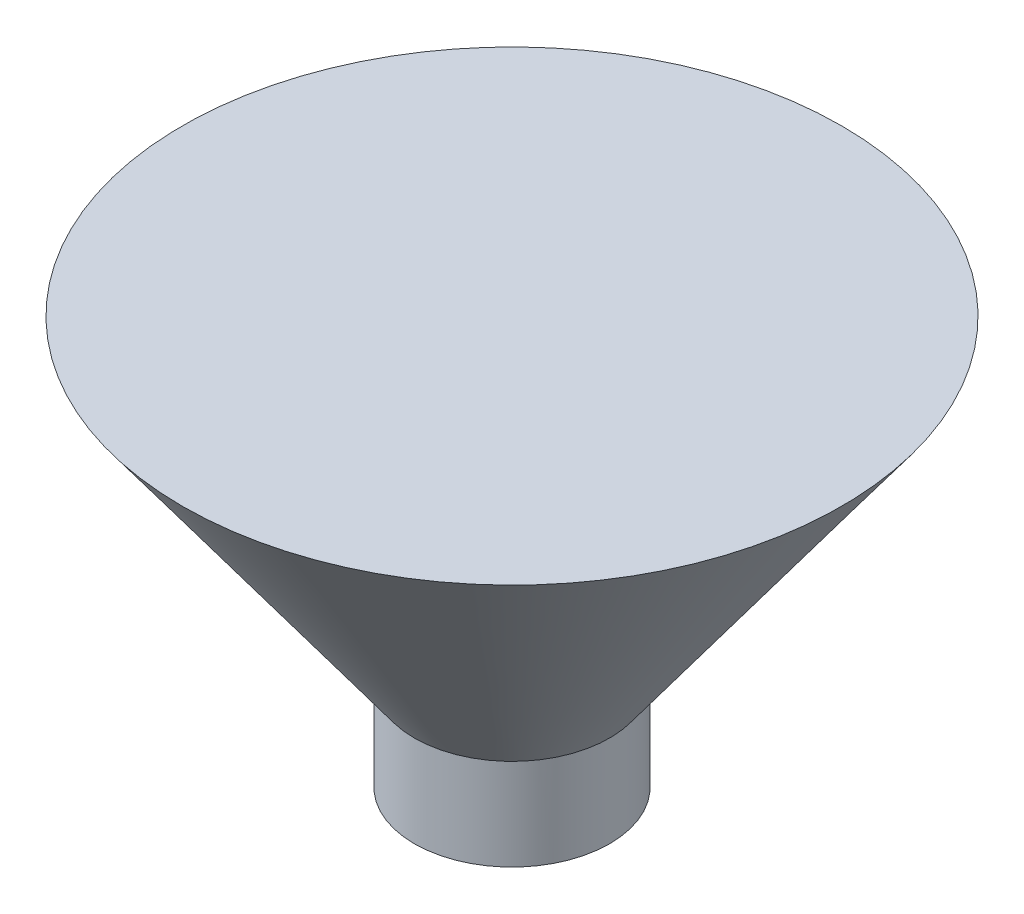
ISO-10303-21;
HEADER;
FILE_DESCRIPTION(('STEP AP214'),'2;1');
FILE_NAME('part.step','',(''),(''),'','','');
FILE_SCHEMA(('AUTOMOTIVE_DESIGN { 1 0 10303 214 1 1 1 1 }'));
ENDSEC;
DATA;
#1=APPLICATION_CONTEXT('core data for automotive mechanical design processes');
#2=APPLICATION_PROTOCOL_DEFINITION('international standard','automotive_design',2000,#1);
#3=PRODUCT_CONTEXT('',#1,'mechanical');
#4=PRODUCT('Part','Part','',(#3));
#5=PRODUCT_RELATED_PRODUCT_CATEGORY('part','',(#4));
#6=PRODUCT_DEFINITION_FORMATION('','',#4);
#7=PRODUCT_DEFINITION_CONTEXT('part definition',#1,'design');
#8=PRODUCT_DEFINITION('design','',#6,#7);
#9=PRODUCT_DEFINITION_SHAPE('','',#8);
#10=(LENGTH_UNIT() NAMED_UNIT(*) SI_UNIT(.MILLI.,.METRE.));
#11=(NAMED_UNIT(*) PLANE_ANGLE_UNIT() SI_UNIT($,.RADIAN.));
#12=(NAMED_UNIT(*) SI_UNIT($,.STERADIAN.) SOLID_ANGLE_UNIT());
#13=UNCERTAINTY_MEASURE_WITH_UNIT(LENGTH_MEASURE(1.E-05),#10,'distance_accuracy_value','');
#14=(GEOMETRIC_REPRESENTATION_CONTEXT(3) GLOBAL_UNCERTAINTY_ASSIGNED_CONTEXT((#13)) GLOBAL_UNIT_ASSIGNED_CONTEXT((#10,
#11,#12)) REPRESENTATION_CONTEXT('',''));
#15=CARTESIAN_POINT('',(0.,0.,0.));
#16=DIRECTION('',(0.,0.,1.));
#17=DIRECTION('',(1.,0.,0.));
#18=AXIS2_PLACEMENT_3D('',#15,#16,#17);
#19=CARTESIAN_POINT('',(0.,0.,0.));
#20=DIRECTION('',(0.,1.,0.));
#21=DIRECTION('',(0.,0.,1.));
#22=AXIS2_PLACEMENT_3D('',#19,#20,#21);
#23=CONICAL_SURFACE('',#22,16.,0.632092653285796);
#24=CARTESIAN_POINT('',(0.,51.889547150163,0.));
#25=DIRECTION('',(0.,-1.,0.));
#26=DIRECTION('',(0.,0.,-1.));
#27=AXIS2_PLACEMENT_3D('',#24,#25,#26);
#28=CIRCLE('',#27,54.);
#29=CARTESIAN_POINT('',(0.,51.889547150163,54.));
#30=VERTEX_POINT('',#29);
#31=EDGE_CURVE('E37',#30,#30,#28,.T.);
#32=CARTESIAN_POINT('',(0.,0.,0.));
#33=DIRECTION('',(0.,-1.,0.));
#34=DIRECTION('',(0.,0.,-1.));
#35=AXIS2_PLACEMENT_3D('',#32,#33,#34);
#36=CIRCLE('',#35,16.);
#37=CARTESIAN_POINT('',(0.,0.,16.));
#38=VERTEX_POINT('',#37);
#39=EDGE_CURVE('E10',#38,#38,#36,.T.);
#40=CARTESIAN_POINT('',(0.,51.889547150163,54.));
#41=CARTESIAN_POINT('',(0.,51.3490310340155,53.6041666666667));
#42=CARTESIAN_POINT('',(0.,50.8085149178679,53.2083333333333));
#43=CARTESIAN_POINT('',(0.,49.7274826855729,52.4166666666667));
#44=CARTESIAN_POINT('',(0.,49.1869665694253,52.0208333333333));
#45=CARTESIAN_POINT('',(0.,48.1059343371303,51.2291666666667));
#46=CARTESIAN_POINT('',(0.,47.5654182209827,50.8333333333333));
#47=CARTESIAN_POINT('',(0.,46.4843859886877,50.0416666666667));
#48=CARTESIAN_POINT('',(0.,45.9438698725401,49.6458333333333));
#49=CARTESIAN_POINT('',(0.,44.8628376402451,48.8541666666667));
#50=CARTESIAN_POINT('',(0.,44.3223215240976,48.4583333333333));
#51=CARTESIAN_POINT('',(0.,43.2412892918025,47.6666666666667));
#52=CARTESIAN_POINT('',(0.,42.700773175655,47.2708333333333));
#53=CARTESIAN_POINT('',(0.,41.6197409433599,46.4791666666667));
#54=CARTESIAN_POINT('',(0.,41.0792248272124,46.0833333333333));
#55=CARTESIAN_POINT('',(0.,39.9981925949173,45.2916666666667));
#56=CARTESIAN_POINT('',(0.,39.4576764787698,44.8958333333333));
#57=CARTESIAN_POINT('',(0.,38.3766442464747,44.1041666666667));
#58=CARTESIAN_POINT('',(0.,37.8361281303272,43.7083333333333));
#59=CARTESIAN_POINT('',(0.,36.7550958980321,42.9166666666667));
#60=CARTESIAN_POINT('',(0.,36.2145797818846,42.5208333333333));
#61=CARTESIAN_POINT('',(0.,35.1335475495895,41.7291666666667));
#62=CARTESIAN_POINT('',(0.,34.593031433442,41.3333333333333));
#63=CARTESIAN_POINT('',(0.,33.5119992011469,40.5416666666667));
#64=CARTESIAN_POINT('',(0.,32.9714830849994,40.1458333333333));
#65=CARTESIAN_POINT('',(0.,31.8904508527043,39.3541666666667));
#66=CARTESIAN_POINT('',(0.,31.3499347365568,38.9583333333333));
#67=CARTESIAN_POINT('',(0.,30.2689025042617,38.1666666666667));
#68=CARTESIAN_POINT('',(0.,29.7283863881142,37.7708333333333));
#69=CARTESIAN_POINT('',(0.,28.6473541558191,36.9791666666667));
#70=CARTESIAN_POINT('',(0.,28.1068380396716,36.5833333333333));
#71=CARTESIAN_POINT('',(0.,27.0258058073766,35.7916666666667));
#72=CARTESIAN_POINT('',(0.,26.485289691229,35.3958333333333));
#73=CARTESIAN_POINT('',(0.,25.404257458934,34.6041666666667));
#74=CARTESIAN_POINT('',(0.,24.8637413427864,34.2083333333333));
#75=CARTESIAN_POINT('',(0.,23.7827091104914,33.4166666666667));
#76=CARTESIAN_POINT('',(0.,23.2421929943438,33.0208333333333));
#77=CARTESIAN_POINT('',(0.,22.1611607620488,32.2291666666667));
#78=CARTESIAN_POINT('',(0.,21.6206446459012,31.8333333333333));
#79=CARTESIAN_POINT('',(0.,20.5396124136062,31.0416666666667));
#80=CARTESIAN_POINT('',(0.,19.9990962974587,30.6458333333333));
#81=CARTESIAN_POINT('',(0.,18.9180640651636,29.8541666666667));
#82=CARTESIAN_POINT('',(0.,18.3775479490161,29.4583333333333));
#83=CARTESIAN_POINT('',(0.,17.296515716721,28.6666666666667));
#84=CARTESIAN_POINT('',(0.,16.7559996005735,28.2708333333333));
#85=CARTESIAN_POINT('',(0.,15.6749673682784,27.4791666666667));
#86=CARTESIAN_POINT('',(0.,15.1344512521309,27.0833333333333));
#87=CARTESIAN_POINT('',(0.,14.0534190198358,26.2916666666667));
#88=CARTESIAN_POINT('',(0.,13.5129029036883,25.8958333333333));
#89=CARTESIAN_POINT('',(0.,12.4318706713932,25.1041666666667));
#90=CARTESIAN_POINT('',(0.,11.8913545552457,24.7083333333333));
#91=CARTESIAN_POINT('',(0.,10.8103223229506,23.9166666666667));
#92=CARTESIAN_POINT('',(0.,10.2698062068031,23.5208333333333));
#93=CARTESIAN_POINT('',(0.,9.18877397450803,22.7291666666667));
#94=CARTESIAN_POINT('',(0.,8.6482578583605,22.3333333333333));
#95=CARTESIAN_POINT('',(0.,7.56722562606543,21.5416666666667));
#96=CARTESIAN_POINT('',(0.,7.0267095099179,21.1458333333333));
#97=CARTESIAN_POINT('',(0.,5.94567727762284,20.3541666666667));
#98=CARTESIAN_POINT('',(0.,5.40516116147531,19.9583333333333));
#99=CARTESIAN_POINT('',(0.,4.32412892918025,19.1666666666667));
#100=CARTESIAN_POINT('',(0.,3.78361281303272,18.7708333333333));
#101=CARTESIAN_POINT('',(0.,2.70258058073766,17.9791666666667));
#102=CARTESIAN_POINT('',(0.,2.16206446459013,17.5833333333333));
#103=CARTESIAN_POINT('',(0.,1.08103223229506,16.7916666666667));
#104=CARTESIAN_POINT('',(0.,0.540516116147531,16.3958333333333));
#105=CARTESIAN_POINT('',(0.,0.,16.));
#106=B_SPLINE_CURVE_WITH_KNOTS('',3,(#40,#41,#42,#43,#44,#45,#46,#47,#48,#49,#50,#51,#52,#53,
#54,#55,#56,#57,#58,#59,#60,#61,#62,#63,#64,#65,#66,#67,#68,#69,#70,#71,#72,#73,#74,#75,#76,#77,
#78,#79,#80,#81,#82,#83,#84,#85,#86,#87,#88,#89,#90,#91,#92,#93,#94,#95,#96,#97,#98,#99,#100,
#101,#102,#103,#104,#105),.UNSPECIFIED.,.F.,.F.,(4,2,2,2,2,2,2,2,2,2,2,2,2,2,2,2,2,2,2,2,2,2,2,
2,2,2,2,2,2,2,2,2,4),(0.,2.00986947246255,4.01973894492511,6.02960841738766,8.03947788985021,
10.0493473623128,12.0592168347753,14.0690863072379,16.0789557797004,18.088825252163,
20.0986947246255,22.1085641970881,24.1184336695506,26.1283031420132,28.1381726144757,
30.1480420869383,32.1579115594009,34.1677810318634,36.177650504326,38.1875199767885,
40.1973894492511,42.2072589217136,44.2171283941762,46.2269978666387,48.2368673391013,
50.2467368115638,52.2566062840264,54.2664757564889,56.2763452289515,58.286214701414,
60.2960841738766,62.3059536463391,64.3158231188017),.UNSPECIFIED.);
#107=EDGE_CURVE('BSEAM31',#30,#38,#106,.T.);
#108=ORIENTED_EDGE('',*,*,#31,.T.);
#109=ORIENTED_EDGE('',*,*,#39,.F.);
#110=ORIENTED_EDGE('',*,*,#107,.T.);
#111=ORIENTED_EDGE('',*,*,#107,.F.);
#112=EDGE_LOOP('',(#108,#110,#109,#111));
#113=FACE_BOUND('',#112,.T.);
#114=ADVANCED_FACE('F31',(#113),#23,.T.);
#115=CARTESIAN_POINT('',(54.,51.889547150163,0.));
#116=DIRECTION('',(0.,1.,0.));
#117=DIRECTION('',(0.,0.,1.));
#118=AXIS2_PLACEMENT_3D('',#115,#116,#117);
#119=PLANE('',#118);
#120=ORIENTED_EDGE('',*,*,#31,.F.);
#121=EDGE_LOOP('',(#120));
#122=FACE_BOUND('',#121,.T.);
#123=ADVANCED_FACE('F52',(#122),#119,.T.);
#124=CARTESIAN_POINT('',(0.,-15.,0.));
#125=DIRECTION('',(0.,1.,0.));
#126=DIRECTION('',(0.,0.,1.));
#127=AXIS2_PLACEMENT_3D('',#124,#125,#126);
#128=CYLINDRICAL_SURFACE('',#127,16.);
#129=CARTESIAN_POINT('',(0.,-15.,0.));
#130=DIRECTION('',(0.,-1.,0.));
#131=DIRECTION('',(0.,0.,-1.));
#132=AXIS2_PLACEMENT_3D('',#129,#130,#131);
#133=CIRCLE('',#132,16.);
#134=CARTESIAN_POINT('',(0.,-15.,-16.));
#135=VERTEX_POINT('',#134);
#136=EDGE_CURVE('E41',#135,#135,#133,.T.);
#137=ORIENTED_EDGE('',*,*,#136,.F.);
#138=EDGE_LOOP('',(#137));
#139=FACE_BOUND('',#138,.T.);
#140=ORIENTED_EDGE('',*,*,#39,.T.);
#141=EDGE_LOOP('',(#140));
#142=FACE_BOUND('',#141,.T.);
#143=ADVANCED_FACE('F50',(#139,#142),#128,.T.);
#144=CARTESIAN_POINT('',(0.,-15.,0.));
#145=DIRECTION('',(0.,-1.,0.));
#146=DIRECTION('',(0.,0.,-1.));
#147=AXIS2_PLACEMENT_3D('',#144,#145,#146);
#148=PLANE('',#147);
#149=ORIENTED_EDGE('',*,*,#136,.T.);
#150=EDGE_LOOP('',(#149));
#151=FACE_BOUND('',#150,.T.);
#152=ADVANCED_FACE('F48',(#151),#148,.T.);
#153=CLOSED_SHELL('',(#114,#123,#143,#152));
#154=MANIFOLD_SOLID_BREP('B2',#153);
#155=ADVANCED_BREP_SHAPE_REPRESENTATION('',(#18,#154),#14);
#156=SHAPE_DEFINITION_REPRESENTATION(#9,#155);
ENDSEC;
END-ISO-10303-21;
